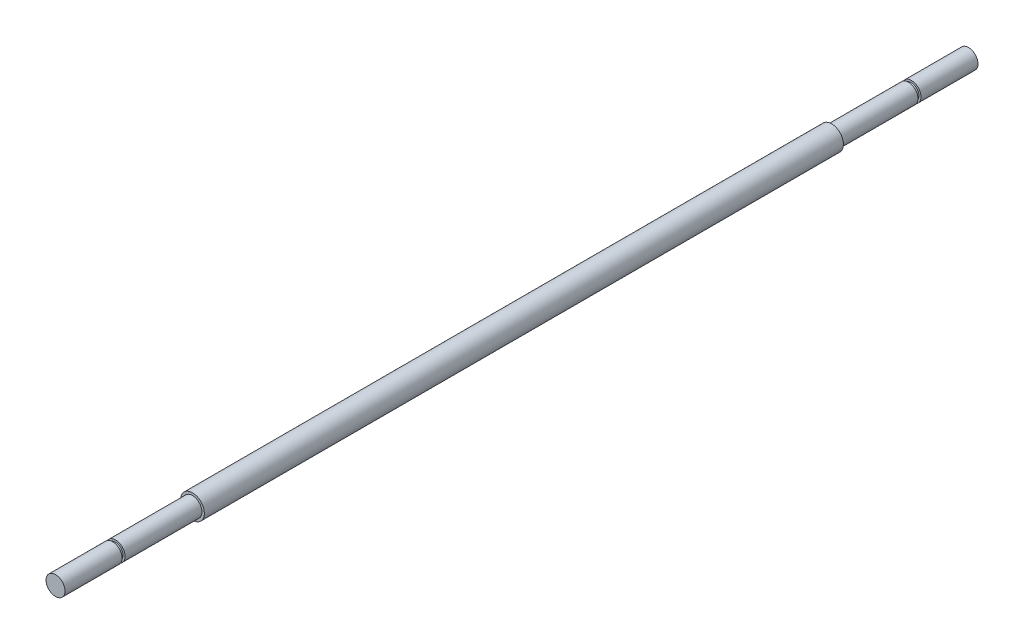
ISO-10303-21;
HEADER;
FILE_DESCRIPTION(('STEP AP214'),'2;1');
FILE_NAME('part.step','',(''),(''),'','','');
FILE_SCHEMA(('AUTOMOTIVE_DESIGN { 1 0 10303 214 1 1 1 1 }'));
ENDSEC;
DATA;
#1=APPLICATION_CONTEXT('core data for automotive mechanical design processes');
#2=APPLICATION_PROTOCOL_DEFINITION('international standard','automotive_design',2000,#1);
#3=PRODUCT_CONTEXT('',#1,'mechanical');
#4=PRODUCT('Part','Part','',(#3));
#5=PRODUCT_RELATED_PRODUCT_CATEGORY('part','',(#4));
#6=PRODUCT_DEFINITION_FORMATION('','',#4);
#7=PRODUCT_DEFINITION_CONTEXT('part definition',#1,'design');
#8=PRODUCT_DEFINITION('design','',#6,#7);
#9=PRODUCT_DEFINITION_SHAPE('','',#8);
#10=(LENGTH_UNIT() NAMED_UNIT(*) SI_UNIT(.MILLI.,.METRE.));
#11=(NAMED_UNIT(*) PLANE_ANGLE_UNIT() SI_UNIT($,.RADIAN.));
#12=(NAMED_UNIT(*) SI_UNIT($,.STERADIAN.) SOLID_ANGLE_UNIT());
#13=UNCERTAINTY_MEASURE_WITH_UNIT(LENGTH_MEASURE(1.E-05),#10,'distance_accuracy_value','');
#14=(GEOMETRIC_REPRESENTATION_CONTEXT(3) GLOBAL_UNCERTAINTY_ASSIGNED_CONTEXT((#13)) GLOBAL_UNIT_ASSIGNED_CONTEXT((#10,
#11,#12)) REPRESENTATION_CONTEXT('',''));
#15=CARTESIAN_POINT('',(0.,0.,0.));
#16=DIRECTION('',(0.,0.,1.));
#17=DIRECTION('',(1.,0.,0.));
#18=AXIS2_PLACEMENT_3D('',#15,#16,#17);
#19=CARTESIAN_POINT('',(0.,0.,608.819798673658));
#20=DIRECTION('',(0.,0.,1.));
#21=DIRECTION('',(-1.,0.,0.));
#22=AXIS2_PLACEMENT_3D('',#19,#20,#21);
#23=CYLINDRICAL_SURFACE('',#22,6.35);
#24=CARTESIAN_POINT('',(0.,0.,518.16));
#25=DIRECTION('',(0.,0.,-1.));
#26=DIRECTION('',(-1.,0.,0.));
#27=AXIS2_PLACEMENT_3D('',#24,#25,#26);
#28=CIRCLE('',#27,6.35);
#29=CARTESIAN_POINT('',(-6.35,0.,518.16));
#30=VERTEX_POINT('',#29);
#31=EDGE_CURVE('E89',#30,#30,#28,.T.);
#32=ORIENTED_EDGE('',*,*,#31,.F.);
#33=EDGE_LOOP('',(#32));
#34=FACE_BOUND('',#33,.T.);
#35=CARTESIAN_POINT('',(0.,0.,569.5));
#36=DIRECTION('',(0.,0.,1.));
#37=DIRECTION('',(1.,0.,0.));
#38=AXIS2_PLACEMENT_3D('',#35,#36,#37);
#39=CIRCLE('',#38,6.35);
#40=CARTESIAN_POINT('',(6.35,0.,569.5));
#41=VERTEX_POINT('',#40);
#42=EDGE_CURVE('E79',#41,#41,#39,.T.);
#43=ORIENTED_EDGE('',*,*,#42,.F.);
#44=EDGE_LOOP('',(#43));
#45=FACE_BOUND('',#44,.T.);
#46=ADVANCED_FACE('F51',(#34,#45),#23,.T.);
#47=CARTESIAN_POINT('',(0.,0.,609.6));
#48=DIRECTION('',(0.,0.,-1.));
#49=DIRECTION('',(-1.,0.,0.));
#50=AXIS2_PLACEMENT_3D('',#47,#48,#49);
#51=CYLINDRICAL_SURFACE('',#50,7.9375);
#52=CARTESIAN_POINT('',(0.,0.,91.44));
#53=DIRECTION('',(0.,0.,-1.));
#54=DIRECTION('',(-1.,0.,0.));
#55=AXIS2_PLACEMENT_3D('',#52,#53,#54);
#56=CIRCLE('',#55,7.9375);
#57=CARTESIAN_POINT('',(-7.9375,0.,91.44));
#58=VERTEX_POINT('',#57);
#59=EDGE_CURVE('E12',#58,#58,#56,.T.);
#60=CARTESIAN_POINT('',(0.,0.,518.16));
#61=DIRECTION('',(0.,0.,-1.));
#62=DIRECTION('',(-1.,0.,0.));
#63=AXIS2_PLACEMENT_3D('',#60,#61,#62);
#64=CIRCLE('',#63,7.9375);
#65=CARTESIAN_POINT('',(-7.9375,0.,518.16));
#66=VERTEX_POINT('',#65);
#67=EDGE_CURVE('E107',#66,#66,#64,.T.);
#68=CARTESIAN_POINT('',(-7.9375,0.,91.44));
#69=CARTESIAN_POINT('',(-7.9375,0.,95.885));
#70=CARTESIAN_POINT('',(-7.9375,0.,100.33));
#71=CARTESIAN_POINT('',(-7.9375,0.,109.22));
#72=CARTESIAN_POINT('',(-7.9375,0.,113.665));
#73=CARTESIAN_POINT('',(-7.9375,0.,122.555));
#74=CARTESIAN_POINT('',(-7.9375,0.,127.));
#75=CARTESIAN_POINT('',(-7.9375,0.,135.89));
#76=CARTESIAN_POINT('',(-7.9375,0.,140.335));
#77=CARTESIAN_POINT('',(-7.9375,0.,149.225));
#78=CARTESIAN_POINT('',(-7.9375,0.,153.67));
#79=CARTESIAN_POINT('',(-7.9375,0.,162.56));
#80=CARTESIAN_POINT('',(-7.9375,0.,167.005));
#81=CARTESIAN_POINT('',(-7.9375,0.,175.895));
#82=CARTESIAN_POINT('',(-7.9375,0.,180.34));
#83=CARTESIAN_POINT('',(-7.9375,0.,189.23));
#84=CARTESIAN_POINT('',(-7.9375,0.,193.675));
#85=CARTESIAN_POINT('',(-7.9375,0.,202.565));
#86=CARTESIAN_POINT('',(-7.9375,0.,207.01));
#87=CARTESIAN_POINT('',(-7.9375,0.,215.9));
#88=CARTESIAN_POINT('',(-7.9375,0.,220.345));
#89=CARTESIAN_POINT('',(-7.9375,0.,229.235));
#90=CARTESIAN_POINT('',(-7.9375,0.,233.68));
#91=CARTESIAN_POINT('',(-7.9375,0.,242.57));
#92=CARTESIAN_POINT('',(-7.9375,0.,247.015));
#93=CARTESIAN_POINT('',(-7.9375,0.,255.905));
#94=CARTESIAN_POINT('',(-7.9375,0.,260.35));
#95=CARTESIAN_POINT('',(-7.9375,0.,269.24));
#96=CARTESIAN_POINT('',(-7.9375,0.,273.685));
#97=CARTESIAN_POINT('',(-7.9375,0.,282.575));
#98=CARTESIAN_POINT('',(-7.9375,0.,287.02));
#99=CARTESIAN_POINT('',(-7.9375,0.,295.91));
#100=CARTESIAN_POINT('',(-7.9375,0.,300.355));
#101=CARTESIAN_POINT('',(-7.9375,0.,309.245));
#102=CARTESIAN_POINT('',(-7.9375,0.,313.69));
#103=CARTESIAN_POINT('',(-7.9375,0.,322.58));
#104=CARTESIAN_POINT('',(-7.9375,0.,327.025));
#105=CARTESIAN_POINT('',(-7.9375,0.,335.915));
#106=CARTESIAN_POINT('',(-7.9375,0.,340.36));
#107=CARTESIAN_POINT('',(-7.9375,0.,349.25));
#108=CARTESIAN_POINT('',(-7.9375,0.,353.695));
#109=CARTESIAN_POINT('',(-7.9375,0.,362.585));
#110=CARTESIAN_POINT('',(-7.9375,0.,367.03));
#111=CARTESIAN_POINT('',(-7.9375,0.,375.92));
#112=CARTESIAN_POINT('',(-7.9375,0.,380.365));
#113=CARTESIAN_POINT('',(-7.9375,0.,389.255));
#114=CARTESIAN_POINT('',(-7.9375,0.,393.7));
#115=CARTESIAN_POINT('',(-7.9375,0.,402.59));
#116=CARTESIAN_POINT('',(-7.9375,0.,407.035));
#117=CARTESIAN_POINT('',(-7.9375,0.,415.925));
#118=CARTESIAN_POINT('',(-7.9375,0.,420.37));
#119=CARTESIAN_POINT('',(-7.9375,0.,429.26));
#120=CARTESIAN_POINT('',(-7.9375,0.,433.705));
#121=CARTESIAN_POINT('',(-7.9375,0.,442.595));
#122=CARTESIAN_POINT('',(-7.9375,0.,447.04));
#123=CARTESIAN_POINT('',(-7.9375,0.,455.93));
#124=CARTESIAN_POINT('',(-7.9375,0.,460.375));
#125=CARTESIAN_POINT('',(-7.9375,0.,469.265));
#126=CARTESIAN_POINT('',(-7.9375,0.,473.71));
#127=CARTESIAN_POINT('',(-7.9375,0.,482.6));
#128=CARTESIAN_POINT('',(-7.9375,0.,487.045));
#129=CARTESIAN_POINT('',(-7.9375,0.,495.935));
#130=CARTESIAN_POINT('',(-7.9375,0.,500.38));
#131=CARTESIAN_POINT('',(-7.9375,0.,509.27));
#132=CARTESIAN_POINT('',(-7.9375,0.,513.715));
#133=CARTESIAN_POINT('',(-7.9375,0.,518.16));
#134=B_SPLINE_CURVE_WITH_KNOTS('',3,(#68,#69,#70,#71,#72,#73,#74,#75,#76,#77,#78,#79,#80,#81,
#82,#83,#84,#85,#86,#87,#88,#89,#90,#91,#92,#93,#94,#95,#96,#97,#98,#99,#100,#101,#102,#103,
#104,#105,#106,#107,#108,#109,#110,#111,#112,#113,#114,#115,#116,#117,#118,#119,#120,#121,#122,
#123,#124,#125,#126,#127,#128,#129,#130,#131,#132,#133),.UNSPECIFIED.,.F.,.F.,(4,2,2,2,2,2,2,2,
2,2,2,2,2,2,2,2,2,2,2,2,2,2,2,2,2,2,2,2,2,2,2,2,4),(0.,13.335,26.67,40.005,53.34,66.675,80.01,
93.345,106.68,120.015,133.35,146.685,160.02,173.355,186.69,200.025,213.36,226.695,240.03,
253.365,266.7,280.035,293.37,306.705,320.04,333.375,346.71,360.045,373.38,386.715,400.05,
413.385,426.72),.UNSPECIFIED.);
#135=EDGE_CURVE('BSEAM53',#58,#66,#134,.T.);
#136=ORIENTED_EDGE('',*,*,#59,.F.);
#137=ORIENTED_EDGE('',*,*,#67,.T.);
#138=ORIENTED_EDGE('',*,*,#135,.T.);
#139=ORIENTED_EDGE('',*,*,#135,.F.);
#140=EDGE_LOOP('',(#136,#138,#137,#139));
#141=FACE_BOUND('',#140,.T.);
#142=ADVANCED_FACE('F53',(#141),#51,.T.);
#143=CARTESIAN_POINT('',(0.,0.,0.78020132634235));
#144=DIRECTION('',(0.,0.,-1.));
#145=DIRECTION('',(-1.,0.,0.));
#146=AXIS2_PLACEMENT_3D('',#143,#144,#145);
#147=CYLINDRICAL_SURFACE('',#146,6.35);
#148=CARTESIAN_POINT('',(0.,0.,91.44));
#149=DIRECTION('',(0.,0.,-1.));
#150=DIRECTION('',(-1.,0.,0.));
#151=AXIS2_PLACEMENT_3D('',#148,#149,#150);
#152=CIRCLE('',#151,6.35);
#153=CARTESIAN_POINT('',(-6.35,0.,91.44));
#154=VERTEX_POINT('',#153);
#155=EDGE_CURVE('E67',#154,#154,#152,.T.);
#156=ORIENTED_EDGE('',*,*,#155,.T.);
#157=EDGE_LOOP('',(#156));
#158=FACE_BOUND('',#157,.T.);
#159=CARTESIAN_POINT('',(0.,0.,40.1));
#160=DIRECTION('',(0.,0.,-1.));
#161=DIRECTION('',(-1.,0.,0.));
#162=AXIS2_PLACEMENT_3D('',#159,#160,#161);
#163=CIRCLE('',#162,6.35);
#164=CARTESIAN_POINT('',(-6.35,0.,40.1));
#165=VERTEX_POINT('',#164);
#166=EDGE_CURVE('E71',#165,#165,#163,.T.);
#167=ORIENTED_EDGE('',*,*,#166,.F.);
#168=EDGE_LOOP('',(#167));
#169=FACE_BOUND('',#168,.T.);
#170=ADVANCED_FACE('F122',(#158,#169),#147,.T.);
#171=CARTESIAN_POINT('',(6.35,0.,91.44));
#172=DIRECTION('',(0.,0.,-1.));
#173=DIRECTION('',(-1.,0.,0.));
#174=AXIS2_PLACEMENT_3D('',#171,#172,#173);
#175=PLANE('',#174);
#176=ORIENTED_EDGE('',*,*,#59,.T.);
#177=EDGE_LOOP('',(#176));
#178=FACE_BOUND('',#177,.T.);
#179=ORIENTED_EDGE('',*,*,#155,.F.);
#180=EDGE_LOOP('',(#179));
#181=FACE_BOUND('',#180,.T.);
#182=ADVANCED_FACE('F125',(#178,#181),#175,.T.);
#183=CARTESIAN_POINT('',(7.6708,0.,38.1));
#184=DIRECTION('',(0.,0.,1.));
#185=DIRECTION('',(1.,0.,0.));
#186=AXIS2_PLACEMENT_3D('',#183,#184,#185);
#187=PLANE('',#186);
#188=CARTESIAN_POINT('',(0.,0.,38.1));
#189=DIRECTION('',(0.,0.,-1.));
#190=DIRECTION('',(-1.,0.,0.));
#191=AXIS2_PLACEMENT_3D('',#188,#189,#190);
#192=CIRCLE('',#191,5.0292);
#193=CARTESIAN_POINT('',(-5.0292,0.,38.1));
#194=VERTEX_POINT('',#193);
#195=EDGE_CURVE('E76',#194,#194,#192,.T.);
#196=ORIENTED_EDGE('',*,*,#195,.T.);
#197=EDGE_LOOP('',(#196));
#198=FACE_BOUND('',#197,.T.);
#199=CARTESIAN_POINT('',(0.,0.,38.1));
#200=DIRECTION('',(0.,0.,1.));
#201=DIRECTION('',(1.,0.,0.));
#202=AXIS2_PLACEMENT_3D('',#199,#200,#201);
#203=CIRCLE('',#202,6.35);
#204=CARTESIAN_POINT('',(6.35,0.,38.1));
#205=VERTEX_POINT('',#204);
#206=EDGE_CURVE('E75',#205,#205,#203,.T.);
#207=ORIENTED_EDGE('',*,*,#206,.T.);
#208=EDGE_LOOP('',(#207));
#209=FACE_BOUND('',#208,.T.);
#210=ADVANCED_FACE('F127',(#198,#209),#187,.T.);
#211=CARTESIAN_POINT('',(7.6708,0.,40.1));
#212=DIRECTION('',(0.,0.,-1.));
#213=DIRECTION('',(-1.,0.,0.));
#214=AXIS2_PLACEMENT_3D('',#211,#212,#213);
#215=PLANE('',#214);
#216=CARTESIAN_POINT('',(0.,0.,40.1));
#217=DIRECTION('',(0.,0.,-1.));
#218=DIRECTION('',(-1.,0.,0.));
#219=AXIS2_PLACEMENT_3D('',#216,#217,#218);
#220=CIRCLE('',#219,5.0292);
#221=CARTESIAN_POINT('',(-5.0292,0.,40.1));
#222=VERTEX_POINT('',#221);
#223=EDGE_CURVE('E111',#222,#222,#220,.T.);
#224=ORIENTED_EDGE('',*,*,#223,.F.);
#225=EDGE_LOOP('',(#224));
#226=FACE_BOUND('',#225,.T.);
#227=ORIENTED_EDGE('',*,*,#166,.T.);
#228=EDGE_LOOP('',(#227));
#229=FACE_BOUND('',#228,.T.);
#230=ADVANCED_FACE('F133',(#226,#229),#215,.T.);
#231=CARTESIAN_POINT('',(0.,0.,0.));
#232=DIRECTION('',(0.,0.,-1.));
#233=DIRECTION('',(-1.,0.,0.));
#234=AXIS2_PLACEMENT_3D('',#231,#232,#233);
#235=CYLINDRICAL_SURFACE('',#234,5.0292);
#236=ORIENTED_EDGE('',*,*,#223,.T.);
#237=EDGE_LOOP('',(#236));
#238=FACE_BOUND('',#237,.T.);
#239=ORIENTED_EDGE('',*,*,#195,.F.);
#240=EDGE_LOOP('',(#239));
#241=FACE_BOUND('',#240,.T.);
#242=ADVANCED_FACE('F245',(#238,#241),#235,.T.);
#243=CARTESIAN_POINT('',(0.,0.,0.));
#244=DIRECTION('',(0.,0.,1.));
#245=DIRECTION('',(1.,0.,0.));
#246=AXIS2_PLACEMENT_3D('',#243,#244,#245);
#247=PLANE('',#246);
#248=CARTESIAN_POINT('',(0.,0.,0.));
#249=DIRECTION('',(0.,0.,-1.));
#250=DIRECTION('',(-1.,0.,0.));
#251=AXIS2_PLACEMENT_3D('',#248,#249,#250);
#252=CIRCLE('',#251,6.35);
#253=CARTESIAN_POINT('',(-6.35,0.,0.));
#254=VERTEX_POINT('',#253);
#255=EDGE_CURVE('E60',#254,#254,#252,.T.);
#256=ORIENTED_EDGE('',*,*,#255,.T.);
#257=EDGE_LOOP('',(#256));
#258=FACE_BOUND('',#257,.T.);
#259=ADVANCED_FACE('F237',(#258),#247,.F.);
#260=ORIENTED_EDGE('',*,*,#255,.F.);
#261=EDGE_LOOP('',(#260));
#262=FACE_BOUND('',#261,.T.);
#263=ORIENTED_EDGE('',*,*,#206,.F.);
#264=EDGE_LOOP('',(#263));
#265=FACE_BOUND('',#264,.T.);
#266=ADVANCED_FACE('F137',(#262,#265),#147,.T.);
#267=CARTESIAN_POINT('',(6.35,0.,518.16));
#268=DIRECTION('',(0.,0.,1.));
#269=DIRECTION('',(-1.,0.,0.));
#270=AXIS2_PLACEMENT_3D('',#267,#268,#269);
#271=PLANE('',#270);
#272=ORIENTED_EDGE('',*,*,#67,.F.);
#273=EDGE_LOOP('',(#272));
#274=FACE_BOUND('',#273,.T.);
#275=ORIENTED_EDGE('',*,*,#31,.T.);
#276=EDGE_LOOP('',(#275));
#277=FACE_BOUND('',#276,.T.);
#278=ADVANCED_FACE('F166',(#274,#277),#271,.T.);
#279=CARTESIAN_POINT('',(7.6708,0.,571.5));
#280=DIRECTION('',(0.,0.,-1.));
#281=DIRECTION('',(1.,0.,0.));
#282=AXIS2_PLACEMENT_3D('',#279,#280,#281);
#283=PLANE('',#282);
#284=CARTESIAN_POINT('',(0.,0.,571.5));
#285=DIRECTION('',(0.,0.,-1.));
#286=DIRECTION('',(-1.,0.,0.));
#287=AXIS2_PLACEMENT_3D('',#284,#285,#286);
#288=CIRCLE('',#287,5.0292);
#289=CARTESIAN_POINT('',(-5.0292,0.,571.5));
#290=VERTEX_POINT('',#289);
#291=EDGE_CURVE('E82',#290,#290,#288,.T.);
#292=ORIENTED_EDGE('',*,*,#291,.F.);
#293=EDGE_LOOP('',(#292));
#294=FACE_BOUND('',#293,.T.);
#295=CARTESIAN_POINT('',(0.,0.,571.5));
#296=DIRECTION('',(0.,0.,-1.));
#297=DIRECTION('',(-1.,0.,0.));
#298=AXIS2_PLACEMENT_3D('',#295,#296,#297);
#299=CIRCLE('',#298,6.35);
#300=CARTESIAN_POINT('',(-6.35,0.,571.5));
#301=VERTEX_POINT('',#300);
#302=EDGE_CURVE('E55',#301,#301,#299,.T.);
#303=ORIENTED_EDGE('',*,*,#302,.T.);
#304=EDGE_LOOP('',(#303));
#305=FACE_BOUND('',#304,.T.);
#306=ADVANCED_FACE('F163',(#294,#305),#283,.T.);
#307=CARTESIAN_POINT('',(7.6708,0.,569.5));
#308=DIRECTION('',(0.,0.,1.));
#309=DIRECTION('',(-1.,0.,0.));
#310=AXIS2_PLACEMENT_3D('',#307,#308,#309);
#311=PLANE('',#310);
#312=CARTESIAN_POINT('',(0.,0.,569.5));
#313=DIRECTION('',(0.,0.,-1.));
#314=DIRECTION('',(-1.,0.,0.));
#315=AXIS2_PLACEMENT_3D('',#312,#313,#314);
#316=CIRCLE('',#315,5.0292);
#317=CARTESIAN_POINT('',(-5.0292,0.,569.5));
#318=VERTEX_POINT('',#317);
#319=EDGE_CURVE('E91',#318,#318,#316,.T.);
#320=ORIENTED_EDGE('',*,*,#319,.T.);
#321=EDGE_LOOP('',(#320));
#322=FACE_BOUND('',#321,.T.);
#323=ORIENTED_EDGE('',*,*,#42,.T.);
#324=EDGE_LOOP('',(#323));
#325=FACE_BOUND('',#324,.T.);
#326=ADVANCED_FACE('F165',(#322,#325),#311,.T.);
#327=CARTESIAN_POINT('',(0.,0.,609.6));
#328=DIRECTION('',(0.,0.,1.));
#329=DIRECTION('',(-1.,0.,0.));
#330=AXIS2_PLACEMENT_3D('',#327,#328,#329);
#331=CYLINDRICAL_SURFACE('',#330,5.0292);
#332=ORIENTED_EDGE('',*,*,#319,.F.);
#333=EDGE_LOOP('',(#332));
#334=FACE_BOUND('',#333,.T.);
#335=ORIENTED_EDGE('',*,*,#291,.T.);
#336=EDGE_LOOP('',(#335));
#337=FACE_BOUND('',#336,.T.);
#338=ADVANCED_FACE('F157',(#334,#337),#331,.T.);
#339=CARTESIAN_POINT('',(0.,0.,609.6));
#340=DIRECTION('',(0.,0.,1.));
#341=DIRECTION('',(1.,0.,0.));
#342=AXIS2_PLACEMENT_3D('',#339,#340,#341);
#343=PLANE('',#342);
#344=CARTESIAN_POINT('',(0.,0.,609.6));
#345=DIRECTION('',(0.,0.,-1.));
#346=DIRECTION('',(-1.,0.,0.));
#347=AXIS2_PLACEMENT_3D('',#344,#345,#346);
#348=CIRCLE('',#347,6.35);
#349=CARTESIAN_POINT('',(-6.35,0.,609.6));
#350=VERTEX_POINT('',#349);
#351=EDGE_CURVE('E103',#350,#350,#348,.T.);
#352=ORIENTED_EDGE('',*,*,#351,.F.);
#353=EDGE_LOOP('',(#352));
#354=FACE_BOUND('',#353,.T.);
#355=ADVANCED_FACE('F152',(#354),#343,.T.);
#356=ORIENTED_EDGE('',*,*,#351,.T.);
#357=EDGE_LOOP('',(#356));
#358=FACE_BOUND('',#357,.T.);
#359=ORIENTED_EDGE('',*,*,#302,.F.);
#360=EDGE_LOOP('',(#359));
#361=FACE_BOUND('',#360,.T.);
#362=ADVANCED_FACE('F142',(#358,#361),#23,.T.);
#363=CLOSED_SHELL('',(#46,#142,#170,#182,#210,#230,#242,#259,#266,#278,#306,#326,#338,#355,#362));
#364=MANIFOLD_SOLID_BREP('B2',#363);
#365=ADVANCED_BREP_SHAPE_REPRESENTATION('',(#18,#364),#14);
#366=SHAPE_DEFINITION_REPRESENTATION(#9,#365);
ENDSEC;
END-ISO-10303-21;
